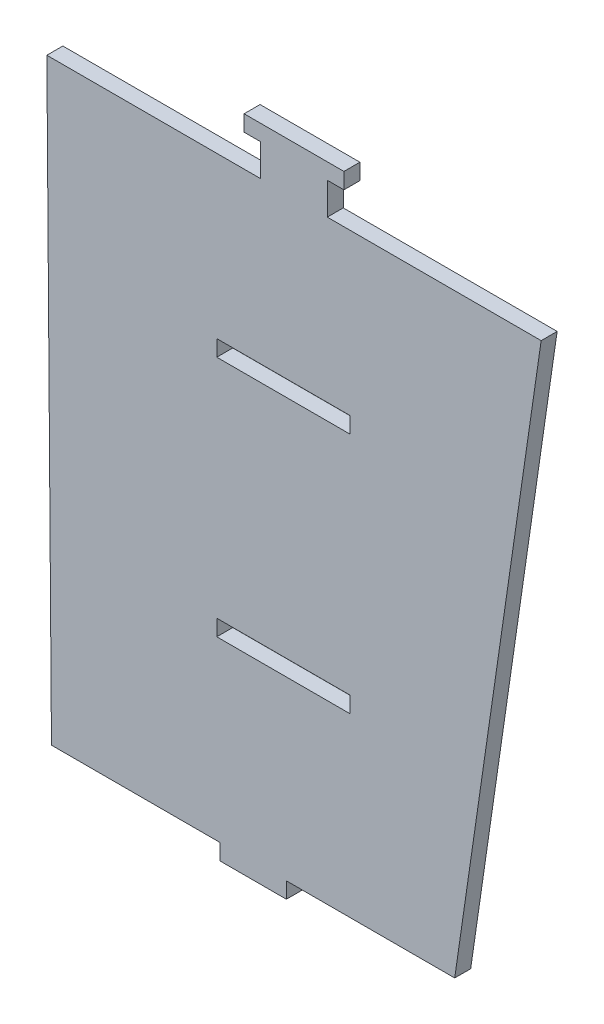
ISO-10303-21;
HEADER;
FILE_DESCRIPTION(('STEP AP214'),'2;1');
FILE_NAME('part.step','',(''),(''),'','','');
FILE_SCHEMA(('AUTOMOTIVE_DESIGN { 1 0 10303 214 1 1 1 1 }'));
ENDSEC;
DATA;
#1=APPLICATION_CONTEXT('core data for automotive mechanical design processes');
#2=APPLICATION_PROTOCOL_DEFINITION('international standard','automotive_design',2000,#1);
#3=PRODUCT_CONTEXT('',#1,'mechanical');
#4=PRODUCT('Part','Part','',(#3));
#5=PRODUCT_RELATED_PRODUCT_CATEGORY('part','',(#4));
#6=PRODUCT_DEFINITION_FORMATION('','',#4);
#7=PRODUCT_DEFINITION_CONTEXT('part definition',#1,'design');
#8=PRODUCT_DEFINITION('design','',#6,#7);
#9=PRODUCT_DEFINITION_SHAPE('','',#8);
#10=(LENGTH_UNIT() NAMED_UNIT(*) SI_UNIT(.MILLI.,.METRE.));
#11=(NAMED_UNIT(*) PLANE_ANGLE_UNIT() SI_UNIT($,.RADIAN.));
#12=(NAMED_UNIT(*) SI_UNIT($,.STERADIAN.) SOLID_ANGLE_UNIT());
#13=UNCERTAINTY_MEASURE_WITH_UNIT(LENGTH_MEASURE(1.E-05),#10,'distance_accuracy_value','');
#14=(GEOMETRIC_REPRESENTATION_CONTEXT(3) GLOBAL_UNCERTAINTY_ASSIGNED_CONTEXT((#13)) GLOBAL_UNIT_ASSIGNED_CONTEXT((#10,
#11,#12)) REPRESENTATION_CONTEXT('',''));
#15=CARTESIAN_POINT('',(0.,0.,0.));
#16=DIRECTION('',(0.,0.,1.));
#17=DIRECTION('',(1.,0.,0.));
#18=AXIS2_PLACEMENT_3D('',#15,#16,#17);
#19=CARTESIAN_POINT('',(-122.883521437337,-1.524,1.524));
#20=DIRECTION('',(0.,-1.,0.));
#21=DIRECTION('',(0.,0.,-1.));
#22=AXIS2_PLACEMENT_3D('',#19,#20,#21);
#23=PLANE('',#22);
#24=DIRECTION('',(-1.,0.,0.));
#25=VECTOR('',#24,1.);
#26=CARTESIAN_POINT('',(-122.883521437337,-1.524,0.));
#27=LINE('',#26,#25);
#28=CARTESIAN_POINT('',(-102.477755774951,-1.524,0.));
#29=VERTEX_POINT('',#28);
#30=CARTESIAN_POINT('',(-122.883521437337,-1.524,0.));
#31=VERTEX_POINT('',#30);
#32=EDGE_CURVE('E260',#29,#31,#27,.T.);
#33=ORIENTED_EDGE('',*,*,#32,.T.);
#34=DIRECTION('',(0.,0.,-1.));
#35=VECTOR('',#34,1.);
#36=CARTESIAN_POINT('',(-122.883521437337,-1.524,1.524));
#37=LINE('',#36,#35);
#38=CARTESIAN_POINT('',(-122.883521437337,-1.524,1.524));
#39=VERTEX_POINT('',#38);
#40=EDGE_CURVE('E11',#39,#31,#37,.T.);
#41=ORIENTED_EDGE('',*,*,#40,.F.);
#42=DIRECTION('',(-1.,0.,0.));
#43=VECTOR('',#42,1.);
#44=CARTESIAN_POINT('',(-122.883521437337,-1.524,1.524));
#45=LINE('',#44,#43);
#46=CARTESIAN_POINT('',(-102.477755774951,-1.524,1.524));
#47=VERTEX_POINT('',#46);
#48=EDGE_CURVE('E267',#47,#39,#45,.T.);
#49=ORIENTED_EDGE('',*,*,#48,.F.);
#50=DIRECTION('',(0.,0.,-1.));
#51=VECTOR('',#50,1.);
#52=CARTESIAN_POINT('',(-102.477755774951,-1.524,1.524));
#53=LINE('',#52,#51);
#54=EDGE_CURVE('E301',#47,#29,#53,.T.);
#55=ORIENTED_EDGE('',*,*,#54,.T.);
#56=EDGE_LOOP('',(#33,#41,#49,#55));
#57=FACE_BOUND('',#56,.T.);
#58=ADVANCED_FACE('F38',(#57),#23,.F.);
#59=CARTESIAN_POINT('',(-122.883521437337,-1.524,1.524));
#60=DIRECTION('',(-1.,0.,0.));
#61=DIRECTION('',(0.,0.,1.));
#62=AXIS2_PLACEMENT_3D('',#59,#60,#61);
#63=PLANE('',#62);
#64=DIRECTION('',(0.,1.,0.));
#65=VECTOR('',#64,1.);
#66=CARTESIAN_POINT('',(-122.883521437337,-1.524,0.));
#67=LINE('',#66,#65);
#68=CARTESIAN_POINT('',(-122.883521437337,1.524,0.));
#69=VERTEX_POINT('',#68);
#70=EDGE_CURVE('E304',#31,#69,#67,.T.);
#71=ORIENTED_EDGE('',*,*,#70,.T.);
#72=DIRECTION('',(0.,0.,-1.));
#73=VECTOR('',#72,1.);
#74=CARTESIAN_POINT('',(-122.883521437337,1.524,1.524));
#75=LINE('',#74,#73);
#76=CARTESIAN_POINT('',(-122.883521437337,1.524,1.524));
#77=VERTEX_POINT('',#76);
#78=EDGE_CURVE('E45',#77,#69,#75,.T.);
#79=ORIENTED_EDGE('',*,*,#78,.F.);
#80=DIRECTION('',(0.,1.,0.));
#81=VECTOR('',#80,1.);
#82=CARTESIAN_POINT('',(-122.883521437337,-1.524,1.524));
#83=LINE('',#82,#81);
#84=EDGE_CURVE('E270',#39,#77,#83,.T.);
#85=ORIENTED_EDGE('',*,*,#84,.F.);
#86=ORIENTED_EDGE('',*,*,#40,.T.);
#87=EDGE_LOOP('',(#71,#79,#85,#86));
#88=FACE_BOUND('',#87,.T.);
#89=ADVANCED_FACE('F400',(#88),#63,.F.);
#90=CARTESIAN_POINT('',(-121.296021437337,1.524,1.524));
#91=DIRECTION('',(0.,1.,0.));
#92=DIRECTION('',(0.,0.,1.));
#93=AXIS2_PLACEMENT_3D('',#90,#91,#92);
#94=PLANE('',#93);
#95=DIRECTION('',(1.,0.,0.));
#96=VECTOR('',#95,1.);
#97=CARTESIAN_POINT('',(-121.296021437337,1.524,0.));
#98=LINE('',#97,#96);
#99=CARTESIAN_POINT('',(-121.296021437337,1.524,0.));
#100=VERTEX_POINT('',#99);
#101=EDGE_CURVE('E306',#69,#100,#98,.T.);
#102=ORIENTED_EDGE('',*,*,#101,.T.);
#103=DIRECTION('',(0.,0.,-1.));
#104=VECTOR('',#103,1.);
#105=CARTESIAN_POINT('',(-121.296021437337,1.524,1.524));
#106=LINE('',#105,#104);
#107=CARTESIAN_POINT('',(-121.296021437337,1.524,1.524));
#108=VERTEX_POINT('',#107);
#109=EDGE_CURVE('E371',#108,#100,#106,.T.);
#110=ORIENTED_EDGE('',*,*,#109,.F.);
#111=DIRECTION('',(1.,0.,0.));
#112=VECTOR('',#111,1.);
#113=CARTESIAN_POINT('',(-121.296021437337,1.524,1.524));
#114=LINE('',#113,#112);
#115=EDGE_CURVE('E273',#77,#108,#114,.T.);
#116=ORIENTED_EDGE('',*,*,#115,.F.);
#117=ORIENTED_EDGE('',*,*,#78,.T.);
#118=EDGE_LOOP('',(#102,#110,#116,#117));
#119=FACE_BOUND('',#118,.T.);
#120=ADVANCED_FACE('F378',(#119),#94,.F.);
#121=CARTESIAN_POINT('',(-121.296021437337,1.524,1.524));
#122=DIRECTION('',(-1.,0.,0.));
#123=DIRECTION('',(0.,0.,1.));
#124=AXIS2_PLACEMENT_3D('',#121,#122,#123);
#125=PLANE('',#124);
#126=DIRECTION('',(0.,1.,0.));
#127=VECTOR('',#126,1.);
#128=CARTESIAN_POINT('',(-121.296021437337,1.524,0.));
#129=LINE('',#128,#127);
#130=CARTESIAN_POINT('',(-121.296021437337,3.048,0.));
#131=VERTEX_POINT('',#130);
#132=EDGE_CURVE('E308',#100,#131,#129,.T.);
#133=ORIENTED_EDGE('',*,*,#132,.T.);
#134=DIRECTION('',(0.,0.,-1.));
#135=VECTOR('',#134,1.);
#136=CARTESIAN_POINT('',(-121.296021437337,3.048,1.524));
#137=LINE('',#136,#135);
#138=CARTESIAN_POINT('',(-121.296021437337,3.048,1.524));
#139=VERTEX_POINT('',#138);
#140=EDGE_CURVE('E368',#139,#131,#137,.T.);
#141=ORIENTED_EDGE('',*,*,#140,.F.);
#142=DIRECTION('',(0.,1.,0.));
#143=VECTOR('',#142,1.);
#144=CARTESIAN_POINT('',(-121.296021437337,1.524,1.524));
#145=LINE('',#144,#143);
#146=EDGE_CURVE('E275',#108,#139,#145,.T.);
#147=ORIENTED_EDGE('',*,*,#146,.F.);
#148=ORIENTED_EDGE('',*,*,#109,.T.);
#149=EDGE_LOOP('',(#133,#141,#147,#148));
#150=FACE_BOUND('',#149,.T.);
#151=ADVANCED_FACE('F388',(#150),#125,.F.);
#152=CARTESIAN_POINT('',(-121.296021437337,3.048,1.524));
#153=DIRECTION('',(0.,-1.,0.));
#154=DIRECTION('',(0.,0.,-1.));
#155=AXIS2_PLACEMENT_3D('',#152,#153,#154);
#156=PLANE('',#155);
#157=DIRECTION('',(-1.,0.,0.));
#158=VECTOR('',#157,1.);
#159=CARTESIAN_POINT('',(-121.296021437337,3.048,0.));
#160=LINE('',#159,#158);
#161=CARTESIAN_POINT('',(-130.821021437337,3.048,0.));
#162=VERTEX_POINT('',#161);
#163=EDGE_CURVE('E310',#131,#162,#160,.T.);
#164=ORIENTED_EDGE('',*,*,#163,.T.);
#165=DIRECTION('',(0.,0.,-1.));
#166=VECTOR('',#165,1.);
#167=CARTESIAN_POINT('',(-130.821021437337,3.048,1.524));
#168=LINE('',#167,#166);
#169=CARTESIAN_POINT('',(-130.821021437337,3.048,1.524));
#170=VERTEX_POINT('',#169);
#171=EDGE_CURVE('E365',#170,#162,#168,.T.);
#172=ORIENTED_EDGE('',*,*,#171,.F.);
#173=DIRECTION('',(-1.,0.,0.));
#174=VECTOR('',#173,1.);
#175=CARTESIAN_POINT('',(-121.296021437337,3.048,1.524));
#176=LINE('',#175,#174);
#177=EDGE_CURVE('E277',#139,#170,#176,.T.);
#178=ORIENTED_EDGE('',*,*,#177,.F.);
#179=ORIENTED_EDGE('',*,*,#140,.T.);
#180=EDGE_LOOP('',(#164,#172,#178,#179));
#181=FACE_BOUND('',#180,.T.);
#182=ADVANCED_FACE('F392',(#181),#156,.F.);
#183=CARTESIAN_POINT('',(-130.821021437337,1.524,1.524));
#184=DIRECTION('',(1.,0.,0.));
#185=DIRECTION('',(0.,0.,-1.));
#186=AXIS2_PLACEMENT_3D('',#183,#184,#185);
#187=PLANE('',#186);
#188=DIRECTION('',(0.,-1.,0.));
#189=VECTOR('',#188,1.);
#190=CARTESIAN_POINT('',(-130.821021437337,1.524,0.));
#191=LINE('',#190,#189);
#192=CARTESIAN_POINT('',(-130.821021437337,1.524,0.));
#193=VERTEX_POINT('',#192);
#194=EDGE_CURVE('E312',#162,#193,#191,.T.);
#195=ORIENTED_EDGE('',*,*,#194,.T.);
#196=DIRECTION('',(0.,0.,-1.));
#197=VECTOR('',#196,1.);
#198=CARTESIAN_POINT('',(-130.821021437337,1.524,1.524));
#199=LINE('',#198,#197);
#200=CARTESIAN_POINT('',(-130.821021437337,1.524,1.524));
#201=VERTEX_POINT('',#200);
#202=EDGE_CURVE('E362',#201,#193,#199,.T.);
#203=ORIENTED_EDGE('',*,*,#202,.F.);
#204=DIRECTION('',(0.,-1.,0.));
#205=VECTOR('',#204,1.);
#206=CARTESIAN_POINT('',(-130.821021437337,1.524,1.524));
#207=LINE('',#206,#205);
#208=EDGE_CURVE('E279',#170,#201,#207,.T.);
#209=ORIENTED_EDGE('',*,*,#208,.F.);
#210=ORIENTED_EDGE('',*,*,#171,.T.);
#211=EDGE_LOOP('',(#195,#203,#209,#210));
#212=FACE_BOUND('',#211,.T.);
#213=ADVANCED_FACE('F453',(#212),#187,.F.);
#214=CARTESIAN_POINT('',(-129.233521437337,1.524,1.524));
#215=DIRECTION('',(0.,1.,0.));
#216=DIRECTION('',(0.,0.,1.));
#217=AXIS2_PLACEMENT_3D('',#214,#215,#216);
#218=PLANE('',#217);
#219=DIRECTION('',(1.,0.,0.));
#220=VECTOR('',#219,1.);
#221=CARTESIAN_POINT('',(-129.233521437337,1.524,0.));
#222=LINE('',#221,#220);
#223=CARTESIAN_POINT('',(-129.233521437337,1.524,0.));
#224=VERTEX_POINT('',#223);
#225=EDGE_CURVE('E314',#193,#224,#222,.T.);
#226=ORIENTED_EDGE('',*,*,#225,.T.);
#227=DIRECTION('',(0.,0.,-1.));
#228=VECTOR('',#227,1.);
#229=CARTESIAN_POINT('',(-129.233521437337,1.524,1.524));
#230=LINE('',#229,#228);
#231=CARTESIAN_POINT('',(-129.233521437337,1.524,1.524));
#232=VERTEX_POINT('',#231);
#233=EDGE_CURVE('E359',#232,#224,#230,.T.);
#234=ORIENTED_EDGE('',*,*,#233,.F.);
#235=DIRECTION('',(1.,0.,0.));
#236=VECTOR('',#235,1.);
#237=CARTESIAN_POINT('',(-129.233521437337,1.524,1.524));
#238=LINE('',#237,#236);
#239=EDGE_CURVE('E281',#201,#232,#238,.T.);
#240=ORIENTED_EDGE('',*,*,#239,.F.);
#241=ORIENTED_EDGE('',*,*,#202,.T.);
#242=EDGE_LOOP('',(#226,#234,#240,#241));
#243=FACE_BOUND('',#242,.T.);
#244=ADVANCED_FACE('F450',(#243),#218,.F.);
#245=CARTESIAN_POINT('',(-129.233521437337,-1.524,1.524));
#246=DIRECTION('',(1.,0.,0.));
#247=DIRECTION('',(0.,0.,-1.));
#248=AXIS2_PLACEMENT_3D('',#245,#246,#247);
#249=PLANE('',#248);
#250=DIRECTION('',(0.,-1.,0.));
#251=VECTOR('',#250,1.);
#252=CARTESIAN_POINT('',(-129.233521437337,-1.524,0.));
#253=LINE('',#252,#251);
#254=CARTESIAN_POINT('',(-129.233521437337,-1.524,0.));
#255=VERTEX_POINT('',#254);
#256=EDGE_CURVE('E316',#224,#255,#253,.T.);
#257=ORIENTED_EDGE('',*,*,#256,.T.);
#258=DIRECTION('',(0.,0.,-1.));
#259=VECTOR('',#258,1.);
#260=CARTESIAN_POINT('',(-129.233521437337,-1.524,1.524));
#261=LINE('',#260,#259);
#262=CARTESIAN_POINT('',(-129.233521437337,-1.524,1.524));
#263=VERTEX_POINT('',#262);
#264=EDGE_CURVE('E356',#263,#255,#261,.T.);
#265=ORIENTED_EDGE('',*,*,#264,.F.);
#266=DIRECTION('',(0.,-1.,0.));
#267=VECTOR('',#266,1.);
#268=CARTESIAN_POINT('',(-129.233521437337,-1.524,1.524));
#269=LINE('',#268,#267);
#270=EDGE_CURVE('E283',#232,#263,#269,.T.);
#271=ORIENTED_EDGE('',*,*,#270,.F.);
#272=ORIENTED_EDGE('',*,*,#233,.T.);
#273=EDGE_LOOP('',(#257,#265,#271,#272));
#274=FACE_BOUND('',#273,.T.);
#275=ADVANCED_FACE('F446',(#274),#249,.F.);
#276=CARTESIAN_POINT('',(-149.639287099722,-1.524,1.524));
#277=DIRECTION('',(0.,-1.,0.));
#278=DIRECTION('',(0.,0.,-1.));
#279=AXIS2_PLACEMENT_3D('',#276,#277,#278);
#280=PLANE('',#279);
#281=DIRECTION('',(-1.,0.,0.));
#282=VECTOR('',#281,1.);
#283=CARTESIAN_POINT('',(-149.639287099722,-1.524,0.));
#284=LINE('',#283,#282);
#285=CARTESIAN_POINT('',(-149.639287099722,-1.524,0.));
#286=VERTEX_POINT('',#285);
#287=EDGE_CURVE('E318',#255,#286,#284,.T.);
#288=ORIENTED_EDGE('',*,*,#287,.T.);
#289=DIRECTION('',(0.,0.,-1.));
#290=VECTOR('',#289,1.);
#291=CARTESIAN_POINT('',(-149.639287099722,-1.524,1.524));
#292=LINE('',#291,#290);
#293=CARTESIAN_POINT('',(-149.639287099722,-1.524,1.524));
#294=VERTEX_POINT('',#293);
#295=EDGE_CURVE('E353',#294,#286,#292,.T.);
#296=ORIENTED_EDGE('',*,*,#295,.F.);
#297=DIRECTION('',(-1.,0.,0.));
#298=VECTOR('',#297,1.);
#299=CARTESIAN_POINT('',(-149.639287099722,-1.524,1.524));
#300=LINE('',#299,#298);
#301=EDGE_CURVE('E285',#263,#294,#300,.T.);
#302=ORIENTED_EDGE('',*,*,#301,.F.);
#303=ORIENTED_EDGE('',*,*,#264,.T.);
#304=EDGE_LOOP('',(#288,#296,#302,#303));
#305=FACE_BOUND('',#304,.T.);
#306=ADVANCED_FACE('F442',(#305),#280,.F.);
#307=CARTESIAN_POINT('',(-149.199401915009,-58.314338925609,1.524));
#308=DIRECTION('',(0.999970002835002,0.00774554259978691,0.));
#309=DIRECTION('',(-0.00774554259978691,0.999970002835003,0.));
#310=AXIS2_PLACEMENT_3D('',#307,#308,#309);
#311=PLANE('',#310);
#312=DIRECTION('',(0.00774554259978691,-0.999970002835002,0.));
#313=VECTOR('',#312,1.);
#314=CARTESIAN_POINT('',(-149.199401915009,-58.314338925609,0.));
#315=LINE('',#314,#313);
#316=CARTESIAN_POINT('',(-149.199401915009,-58.314338925609,0.));
#317=VERTEX_POINT('',#316);
#318=EDGE_CURVE('E320',#286,#317,#315,.T.);
#319=ORIENTED_EDGE('',*,*,#318,.T.);
#320=DIRECTION('',(0.,0.,-1.));
#321=VECTOR('',#320,1.);
#322=CARTESIAN_POINT('',(-149.199401915009,-58.314338925609,1.524));
#323=LINE('',#322,#321);
#324=CARTESIAN_POINT('',(-149.199401915009,-58.314338925609,1.524));
#325=VERTEX_POINT('',#324);
#326=EDGE_CURVE('E350',#325,#317,#323,.T.);
#327=ORIENTED_EDGE('',*,*,#326,.F.);
#328=DIRECTION('',(0.00774554259978691,-0.999970002835002,0.));
#329=VECTOR('',#328,1.);
#330=CARTESIAN_POINT('',(-149.199401915009,-58.314338925609,1.524));
#331=LINE('',#330,#329);
#332=EDGE_CURVE('E287',#294,#325,#331,.T.);
#333=ORIENTED_EDGE('',*,*,#332,.F.);
#334=ORIENTED_EDGE('',*,*,#295,.T.);
#335=EDGE_LOOP('',(#319,#327,#333,#334));
#336=FACE_BOUND('',#335,.T.);
#337=ADVANCED_FACE('F437',(#336),#311,.F.);
#338=CARTESIAN_POINT('',(-133.13789889878,-58.314338925609,1.524));
#339=DIRECTION('',(0.,1.,0.));
#340=DIRECTION('',(-1.,0.,0.));
#341=AXIS2_PLACEMENT_3D('',#338,#339,#340);
#342=PLANE('',#341);
#343=DIRECTION('',(1.,0.,0.));
#344=VECTOR('',#343,1.);
#345=CARTESIAN_POINT('',(-133.13789889878,-58.314338925609,0.));
#346=LINE('',#345,#344);
#347=CARTESIAN_POINT('',(-133.13789889878,-58.314338925609,0.));
#348=VERTEX_POINT('',#347);
#349=EDGE_CURVE('E322',#317,#348,#346,.T.);
#350=ORIENTED_EDGE('',*,*,#349,.T.);
#351=DIRECTION('',(0.,0.,-1.));
#352=VECTOR('',#351,1.);
#353=CARTESIAN_POINT('',(-133.13789889878,-58.314338925609,1.524));
#354=LINE('',#353,#352);
#355=CARTESIAN_POINT('',(-133.13789889878,-58.314338925609,1.524));
#356=VERTEX_POINT('',#355);
#357=EDGE_CURVE('E347',#356,#348,#354,.T.);
#358=ORIENTED_EDGE('',*,*,#357,.F.);
#359=DIRECTION('',(1.,0.,0.));
#360=VECTOR('',#359,1.);
#361=CARTESIAN_POINT('',(-133.13789889878,-58.314338925609,1.524));
#362=LINE('',#361,#360);
#363=EDGE_CURVE('E289',#325,#356,#362,.T.);
#364=ORIENTED_EDGE('',*,*,#363,.F.);
#365=ORIENTED_EDGE('',*,*,#326,.T.);
#366=EDGE_LOOP('',(#350,#358,#364,#365));
#367=FACE_BOUND('',#366,.T.);
#368=ADVANCED_FACE('F431',(#367),#342,.F.);
#369=CARTESIAN_POINT('',(-133.13789889878,-58.314338925609,1.524));
#370=DIRECTION('',(1.,0.,0.));
#371=DIRECTION('',(0.,0.,-1.));
#372=AXIS2_PLACEMENT_3D('',#369,#370,#371);
#373=PLANE('',#372);
#374=DIRECTION('',(0.,-1.,0.));
#375=VECTOR('',#374,1.);
#376=CARTESIAN_POINT('',(-133.13789889878,-58.314338925609,0.));
#377=LINE('',#376,#375);
#378=CARTESIAN_POINT('',(-133.13789889878,-59.838338925609,0.));
#379=VERTEX_POINT('',#378);
#380=EDGE_CURVE('E324',#348,#379,#377,.T.);
#381=ORIENTED_EDGE('',*,*,#380,.T.);
#382=DIRECTION('',(0.,0.,-1.));
#383=VECTOR('',#382,1.);
#384=CARTESIAN_POINT('',(-133.13789889878,-59.838338925609,1.524));
#385=LINE('',#384,#383);
#386=CARTESIAN_POINT('',(-133.13789889878,-59.838338925609,1.524));
#387=VERTEX_POINT('',#386);
#388=EDGE_CURVE('E344',#387,#379,#385,.T.);
#389=ORIENTED_EDGE('',*,*,#388,.F.);
#390=DIRECTION('',(0.,-1.,0.));
#391=VECTOR('',#390,1.);
#392=CARTESIAN_POINT('',(-133.13789889878,-58.314338925609,1.524));
#393=LINE('',#392,#391);
#394=EDGE_CURVE('E291',#356,#387,#393,.T.);
#395=ORIENTED_EDGE('',*,*,#394,.F.);
#396=ORIENTED_EDGE('',*,*,#357,.T.);
#397=EDGE_LOOP('',(#381,#389,#395,#396));
#398=FACE_BOUND('',#397,.T.);
#399=ADVANCED_FACE('F427',(#398),#373,.F.);
#400=CARTESIAN_POINT('',(-133.13789889878,-59.838338925609,1.524));
#401=DIRECTION('',(0.,1.,0.));
#402=DIRECTION('',(0.,0.,1.));
#403=AXIS2_PLACEMENT_3D('',#400,#401,#402);
#404=PLANE('',#403);
#405=DIRECTION('',(1.,0.,0.));
#406=VECTOR('',#405,1.);
#407=CARTESIAN_POINT('',(-133.13789889878,-59.838338925609,0.));
#408=LINE('',#407,#406);
#409=CARTESIAN_POINT('',(-126.78789889878,-59.838338925609,0.));
#410=VERTEX_POINT('',#409);
#411=EDGE_CURVE('E326',#379,#410,#408,.T.);
#412=ORIENTED_EDGE('',*,*,#411,.T.);
#413=DIRECTION('',(0.,0.,-1.));
#414=VECTOR('',#413,1.);
#415=CARTESIAN_POINT('',(-126.78789889878,-59.838338925609,1.524));
#416=LINE('',#415,#414);
#417=CARTESIAN_POINT('',(-126.78789889878,-59.838338925609,1.524));
#418=VERTEX_POINT('',#417);
#419=EDGE_CURVE('E341',#418,#410,#416,.T.);
#420=ORIENTED_EDGE('',*,*,#419,.F.);
#421=DIRECTION('',(1.,0.,0.));
#422=VECTOR('',#421,1.);
#423=CARTESIAN_POINT('',(-133.13789889878,-59.838338925609,1.524));
#424=LINE('',#423,#422);
#425=EDGE_CURVE('E293',#387,#418,#424,.T.);
#426=ORIENTED_EDGE('',*,*,#425,.F.);
#427=ORIENTED_EDGE('',*,*,#388,.T.);
#428=EDGE_LOOP('',(#412,#420,#426,#427));
#429=FACE_BOUND('',#428,.T.);
#430=ADVANCED_FACE('F422',(#429),#404,.F.);
#431=CARTESIAN_POINT('',(-126.78789889878,-58.314338925609,1.524));
#432=DIRECTION('',(-1.,0.,0.));
#433=DIRECTION('',(0.,0.,1.));
#434=AXIS2_PLACEMENT_3D('',#431,#432,#433);
#435=PLANE('',#434);
#436=DIRECTION('',(0.,1.,0.));
#437=VECTOR('',#436,1.);
#438=CARTESIAN_POINT('',(-126.78789889878,-58.314338925609,0.));
#439=LINE('',#438,#437);
#440=CARTESIAN_POINT('',(-126.78789889878,-58.314338925609,0.));
#441=VERTEX_POINT('',#440);
#442=EDGE_CURVE('E328',#410,#441,#439,.T.);
#443=ORIENTED_EDGE('',*,*,#442,.T.);
#444=DIRECTION('',(0.,0.,-1.));
#445=VECTOR('',#444,1.);
#446=CARTESIAN_POINT('',(-126.78789889878,-58.314338925609,1.524));
#447=LINE('',#446,#445);
#448=CARTESIAN_POINT('',(-126.78789889878,-58.314338925609,1.524));
#449=VERTEX_POINT('',#448);
#450=EDGE_CURVE('E338',#449,#441,#447,.T.);
#451=ORIENTED_EDGE('',*,*,#450,.F.);
#452=DIRECTION('',(0.,1.,0.));
#453=VECTOR('',#452,1.);
#454=CARTESIAN_POINT('',(-126.78789889878,-58.314338925609,1.524));
#455=LINE('',#454,#453);
#456=EDGE_CURVE('E295',#418,#449,#455,.T.);
#457=ORIENTED_EDGE('',*,*,#456,.F.);
#458=ORIENTED_EDGE('',*,*,#419,.T.);
#459=EDGE_LOOP('',(#443,#451,#457,#458));
#460=FACE_BOUND('',#459,.T.);
#461=ADVANCED_FACE('F416',(#460),#435,.F.);
#462=CARTESIAN_POINT('',(-110.726395882551,-58.314338925609,1.524));
#463=DIRECTION('',(0.,1.,0.));
#464=DIRECTION('',(0.,0.,1.));
#465=AXIS2_PLACEMENT_3D('',#462,#463,#464);
#466=PLANE('',#465);
#467=DIRECTION('',(1.,0.,0.));
#468=VECTOR('',#467,1.);
#469=CARTESIAN_POINT('',(-110.726395882551,-58.314338925609,0.));
#470=LINE('',#469,#468);
#471=CARTESIAN_POINT('',(-110.726395882551,-58.314338925609,0.));
#472=VERTEX_POINT('',#471);
#473=EDGE_CURVE('E330',#441,#472,#470,.T.);
#474=ORIENTED_EDGE('',*,*,#473,.T.);
#475=DIRECTION('',(0.,0.,-1.));
#476=VECTOR('',#475,1.);
#477=CARTESIAN_POINT('',(-110.726395882551,-58.314338925609,1.524));
#478=LINE('',#477,#476);
#479=CARTESIAN_POINT('',(-110.726395882551,-58.314338925609,1.524));
#480=VERTEX_POINT('',#479);
#481=EDGE_CURVE('E335',#480,#472,#478,.T.);
#482=ORIENTED_EDGE('',*,*,#481,.F.);
#483=DIRECTION('',(1.,0.,0.));
#484=VECTOR('',#483,1.);
#485=CARTESIAN_POINT('',(-110.726395882551,-58.314338925609,1.524));
#486=LINE('',#485,#484);
#487=EDGE_CURVE('E297',#449,#480,#486,.T.);
#488=ORIENTED_EDGE('',*,*,#487,.F.);
#489=ORIENTED_EDGE('',*,*,#450,.T.);
#490=EDGE_LOOP('',(#474,#482,#488,#489));
#491=FACE_BOUND('',#490,.T.);
#492=ADVANCED_FACE('F412',(#491),#466,.F.);
#493=CARTESIAN_POINT('',(-102.477755774951,-1.524,1.524));
#494=DIRECTION('',(-0.98961564073596,0.143738942568655,0.));
#495=DIRECTION('',(-0.143738942568655,-0.98961564073596,0.));
#496=AXIS2_PLACEMENT_3D('',#493,#494,#495);
#497=PLANE('',#496);
#498=DIRECTION('',(0.143738942568655,0.98961564073596,0.));
#499=VECTOR('',#498,1.);
#500=CARTESIAN_POINT('',(-102.477755774951,-1.524,0.));
#501=LINE('',#500,#499);
#502=EDGE_CURVE('E271',#472,#29,#501,.T.);
#503=ORIENTED_EDGE('',*,*,#502,.T.);
#504=ORIENTED_EDGE('',*,*,#54,.F.);
#505=DIRECTION('',(0.143738942568655,0.98961564073596,0.));
#506=VECTOR('',#505,1.);
#507=CARTESIAN_POINT('',(-102.477755774951,-1.524,1.524));
#508=LINE('',#507,#506);
#509=EDGE_CURVE('E299',#480,#47,#508,.T.);
#510=ORIENTED_EDGE('',*,*,#509,.F.);
#511=ORIENTED_EDGE('',*,*,#481,.T.);
#512=EDGE_LOOP('',(#503,#504,#510,#511));
#513=FACE_BOUND('',#512,.T.);
#514=ADVANCED_FACE('F407',(#513),#497,.F.);
#515=CARTESIAN_POINT('',(0.,0.,1.524));
#516=DIRECTION('',(0.,0.,-1.));
#517=DIRECTION('',(-1.,0.,0.));
#518=AXIS2_PLACEMENT_3D('',#515,#516,#517);
#519=PLANE('',#518);
#520=DIRECTION('',(0.,1.,0.));
#521=VECTOR('',#520,1.);
#522=CARTESIAN_POINT('',(-120.728752717354,-41.4719125896507,1.524));
#523=LINE('',#522,#521);
#524=CARTESIAN_POINT('',(-120.728752717354,-41.4719125896507,1.524));
#525=VERTEX_POINT('',#524);
#526=CARTESIAN_POINT('',(-120.728752717354,-39.9341821648906,1.524));
#527=VERTEX_POINT('',#526);
#528=EDGE_CURVE('E225',#525,#527,#523,.T.);
#529=ORIENTED_EDGE('',*,*,#528,.F.);
#530=DIRECTION('',(1.,0.,0.));
#531=VECTOR('',#530,1.);
#532=CARTESIAN_POINT('',(-120.728752717354,-41.4719125896507,1.524));
#533=LINE('',#532,#531);
#534=CARTESIAN_POINT('',(-133.428752717354,-41.4719125896507,1.524));
#535=VERTEX_POINT('',#534);
#536=EDGE_CURVE('E52',#535,#525,#533,.T.);
#537=ORIENTED_EDGE('',*,*,#536,.F.);
#538=DIRECTION('',(0.,-1.,0.));
#539=VECTOR('',#538,1.);
#540=CARTESIAN_POINT('',(-133.428752717354,-41.4719125896507,1.524));
#541=LINE('',#540,#539);
#542=CARTESIAN_POINT('',(-133.428752717354,-39.9341821648906,1.524));
#543=VERTEX_POINT('',#542);
#544=EDGE_CURVE('E216',#543,#535,#541,.T.);
#545=ORIENTED_EDGE('',*,*,#544,.F.);
#546=DIRECTION('',(-1.,0.,0.));
#547=VECTOR('',#546,1.);
#548=CARTESIAN_POINT('',(-120.728752717354,-39.9341821648906,1.524));
#549=LINE('',#548,#547);
#550=EDGE_CURVE('E219',#527,#543,#549,.T.);
#551=ORIENTED_EDGE('',*,*,#550,.F.);
#552=EDGE_LOOP('',(#529,#537,#545,#551));
#553=FACE_BOUND('',#552,.T.);
#554=DIRECTION('',(0.,1.,0.));
#555=VECTOR('',#554,1.);
#556=CARTESIAN_POINT('',(-120.728752717354,-18.370876524361,1.524));
#557=LINE('',#556,#555);
#558=CARTESIAN_POINT('',(-120.728752717354,-18.370876524361,1.524));
#559=VERTEX_POINT('',#558);
#560=CARTESIAN_POINT('',(-120.728752717354,-16.8331460996009,1.524));
#561=VERTEX_POINT('',#560);
#562=EDGE_CURVE('E250',#559,#561,#557,.T.);
#563=ORIENTED_EDGE('',*,*,#562,.F.);
#564=DIRECTION('',(1.,0.,0.));
#565=VECTOR('',#564,1.);
#566=CARTESIAN_POINT('',(-120.728752717354,-18.370876524361,1.524));
#567=LINE('',#566,#565);
#568=CARTESIAN_POINT('',(-133.428752717354,-18.370876524361,1.524));
#569=VERTEX_POINT('',#568);
#570=EDGE_CURVE('E231',#569,#559,#567,.T.);
#571=ORIENTED_EDGE('',*,*,#570,.F.);
#572=DIRECTION('',(0.,-1.,0.));
#573=VECTOR('',#572,1.);
#574=CARTESIAN_POINT('',(-133.428752717354,-18.370876524361,1.524));
#575=LINE('',#574,#573);
#576=CARTESIAN_POINT('',(-133.428752717354,-16.8331460996009,1.524));
#577=VERTEX_POINT('',#576);
#578=EDGE_CURVE('E239',#577,#569,#575,.T.);
#579=ORIENTED_EDGE('',*,*,#578,.F.);
#580=DIRECTION('',(-1.,0.,0.));
#581=VECTOR('',#580,1.);
#582=CARTESIAN_POINT('',(-120.728752717354,-16.8331460996009,1.524));
#583=LINE('',#582,#581);
#584=EDGE_CURVE('E253',#561,#577,#583,.T.);
#585=ORIENTED_EDGE('',*,*,#584,.F.);
#586=EDGE_LOOP('',(#563,#571,#579,#585));
#587=FACE_BOUND('',#586,.T.);
#588=ORIENTED_EDGE('',*,*,#48,.T.);
#589=ORIENTED_EDGE('',*,*,#84,.T.);
#590=ORIENTED_EDGE('',*,*,#115,.T.);
#591=ORIENTED_EDGE('',*,*,#146,.T.);
#592=ORIENTED_EDGE('',*,*,#177,.T.);
#593=ORIENTED_EDGE('',*,*,#208,.T.);
#594=ORIENTED_EDGE('',*,*,#239,.T.);
#595=ORIENTED_EDGE('',*,*,#270,.T.);
#596=ORIENTED_EDGE('',*,*,#301,.T.);
#597=ORIENTED_EDGE('',*,*,#332,.T.);
#598=ORIENTED_EDGE('',*,*,#363,.T.);
#599=ORIENTED_EDGE('',*,*,#394,.T.);
#600=ORIENTED_EDGE('',*,*,#425,.T.);
#601=ORIENTED_EDGE('',*,*,#456,.T.);
#602=ORIENTED_EDGE('',*,*,#487,.T.);
#603=ORIENTED_EDGE('',*,*,#509,.T.);
#604=EDGE_LOOP('',(#588,#589,#590,#591,#592,#593,#594,#595,#596,#597,#598,#599,#600,#601,#602,#603));
#605=FACE_BOUND('',#604,.T.);
#606=ADVANCED_FACE('F396',(#553,#587,#605),#519,.F.);
#607=CARTESIAN_POINT('',(0.,0.,0.));
#608=DIRECTION('',(0.,0.,-1.));
#609=DIRECTION('',(-1.,0.,0.));
#610=AXIS2_PLACEMENT_3D('',#607,#608,#609);
#611=PLANE('',#610);
#612=DIRECTION('',(1.,0.,0.));
#613=VECTOR('',#612,1.);
#614=CARTESIAN_POINT('',(-120.728752717354,-41.4719125896507,0.));
#615=LINE('',#614,#613);
#616=CARTESIAN_POINT('',(-133.428752717354,-41.4719125896507,0.));
#617=VERTEX_POINT('',#616);
#618=CARTESIAN_POINT('',(-120.728752717354,-41.4719125896507,0.));
#619=VERTEX_POINT('',#618);
#620=EDGE_CURVE('E200',#617,#619,#615,.T.);
#621=ORIENTED_EDGE('',*,*,#620,.T.);
#622=DIRECTION('',(0.,1.,0.));
#623=VECTOR('',#622,1.);
#624=CARTESIAN_POINT('',(-120.728752717354,-41.4719125896507,0.));
#625=LINE('',#624,#623);
#626=CARTESIAN_POINT('',(-120.728752717354,-39.9341821648906,0.));
#627=VERTEX_POINT('',#626);
#628=EDGE_CURVE('E209',#619,#627,#625,.T.);
#629=ORIENTED_EDGE('',*,*,#628,.T.);
#630=DIRECTION('',(-1.,0.,0.));
#631=VECTOR('',#630,1.);
#632=CARTESIAN_POINT('',(-120.728752717354,-39.9341821648906,0.));
#633=LINE('',#632,#631);
#634=CARTESIAN_POINT('',(-133.428752717354,-39.9341821648906,0.));
#635=VERTEX_POINT('',#634);
#636=EDGE_CURVE('E60',#627,#635,#633,.T.);
#637=ORIENTED_EDGE('',*,*,#636,.T.);
#638=DIRECTION('',(0.,-1.,0.));
#639=VECTOR('',#638,1.);
#640=CARTESIAN_POINT('',(-133.428752717354,-41.4719125896507,0.));
#641=LINE('',#640,#639);
#642=EDGE_CURVE('E206',#635,#617,#641,.T.);
#643=ORIENTED_EDGE('',*,*,#642,.T.);
#644=EDGE_LOOP('',(#621,#629,#637,#643));
#645=FACE_BOUND('',#644,.T.);
#646=DIRECTION('',(1.,0.,0.));
#647=VECTOR('',#646,1.);
#648=CARTESIAN_POINT('',(-120.728752717354,-18.370876524361,0.));
#649=LINE('',#648,#647);
#650=CARTESIAN_POINT('',(-133.428752717354,-18.370876524361,0.));
#651=VERTEX_POINT('',#650);
#652=CARTESIAN_POINT('',(-120.728752717354,-18.370876524361,0.));
#653=VERTEX_POINT('',#652);
#654=EDGE_CURVE('E235',#651,#653,#649,.T.);
#655=ORIENTED_EDGE('',*,*,#654,.T.);
#656=DIRECTION('',(0.,1.,0.));
#657=VECTOR('',#656,1.);
#658=CARTESIAN_POINT('',(-120.728752717354,-18.370876524361,0.));
#659=LINE('',#658,#657);
#660=CARTESIAN_POINT('',(-120.728752717354,-16.8331460996009,0.));
#661=VERTEX_POINT('',#660);
#662=EDGE_CURVE('E238',#653,#661,#659,.T.);
#663=ORIENTED_EDGE('',*,*,#662,.T.);
#664=DIRECTION('',(-1.,0.,0.));
#665=VECTOR('',#664,1.);
#666=CARTESIAN_POINT('',(-120.728752717354,-16.8331460996009,0.));
#667=LINE('',#666,#665);
#668=CARTESIAN_POINT('',(-133.428752717354,-16.8331460996009,0.));
#669=VERTEX_POINT('',#668);
#670=EDGE_CURVE('E242',#661,#669,#667,.T.);
#671=ORIENTED_EDGE('',*,*,#670,.T.);
#672=DIRECTION('',(0.,-1.,0.));
#673=VECTOR('',#672,1.);
#674=CARTESIAN_POINT('',(-133.428752717354,-18.370876524361,0.));
#675=LINE('',#674,#673);
#676=EDGE_CURVE('E245',#669,#651,#675,.T.);
#677=ORIENTED_EDGE('',*,*,#676,.T.);
#678=EDGE_LOOP('',(#655,#663,#671,#677));
#679=FACE_BOUND('',#678,.T.);
#680=ORIENTED_EDGE('',*,*,#32,.F.);
#681=ORIENTED_EDGE('',*,*,#502,.F.);
#682=ORIENTED_EDGE('',*,*,#473,.F.);
#683=ORIENTED_EDGE('',*,*,#442,.F.);
#684=ORIENTED_EDGE('',*,*,#411,.F.);
#685=ORIENTED_EDGE('',*,*,#380,.F.);
#686=ORIENTED_EDGE('',*,*,#349,.F.);
#687=ORIENTED_EDGE('',*,*,#318,.F.);
#688=ORIENTED_EDGE('',*,*,#287,.F.);
#689=ORIENTED_EDGE('',*,*,#256,.F.);
#690=ORIENTED_EDGE('',*,*,#225,.F.);
#691=ORIENTED_EDGE('',*,*,#194,.F.);
#692=ORIENTED_EDGE('',*,*,#163,.F.);
#693=ORIENTED_EDGE('',*,*,#132,.F.);
#694=ORIENTED_EDGE('',*,*,#101,.F.);
#695=ORIENTED_EDGE('',*,*,#70,.F.);
#696=EDGE_LOOP('',(#680,#681,#682,#683,#684,#685,#686,#687,#688,#689,#690,#691,#692,#693,#694,#695));
#697=FACE_BOUND('',#696,.T.);
#698=ADVANCED_FACE('F213',(#645,#679,#697),#611,.T.);
#699=CARTESIAN_POINT('',(-120.728752717354,-18.370876524361,0.));
#700=DIRECTION('',(0.,-1.,0.));
#701=DIRECTION('',(0.,0.,-1.));
#702=AXIS2_PLACEMENT_3D('',#699,#700,#701);
#703=PLANE('',#702);
#704=ORIENTED_EDGE('',*,*,#570,.T.);
#705=DIRECTION('',(0.,0.,1.));
#706=VECTOR('',#705,1.);
#707=CARTESIAN_POINT('',(-120.728752717354,-18.370876524361,0.));
#708=LINE('',#707,#706);
#709=EDGE_CURVE('E248',#653,#559,#708,.T.);
#710=ORIENTED_EDGE('',*,*,#709,.F.);
#711=ORIENTED_EDGE('',*,*,#654,.F.);
#712=DIRECTION('',(0.,0.,1.));
#713=VECTOR('',#712,1.);
#714=CARTESIAN_POINT('',(-133.428752717354,-18.370876524361,0.));
#715=LINE('',#714,#713);
#716=EDGE_CURVE('E258',#651,#569,#715,.T.);
#717=ORIENTED_EDGE('',*,*,#716,.T.);
#718=EDGE_LOOP('',(#704,#710,#711,#717));
#719=FACE_BOUND('',#718,.T.);
#720=ADVANCED_FACE('F580',(#719),#703,.F.);
#721=CARTESIAN_POINT('',(-133.428752717354,-18.370876524361,0.));
#722=DIRECTION('',(-1.,0.,0.));
#723=DIRECTION('',(0.,0.,1.));
#724=AXIS2_PLACEMENT_3D('',#721,#722,#723);
#725=PLANE('',#724);
#726=ORIENTED_EDGE('',*,*,#578,.T.);
#727=ORIENTED_EDGE('',*,*,#716,.F.);
#728=ORIENTED_EDGE('',*,*,#676,.F.);
#729=DIRECTION('',(0.,0.,1.));
#730=VECTOR('',#729,1.);
#731=CARTESIAN_POINT('',(-133.428752717354,-16.8331460996009,0.));
#732=LINE('',#731,#730);
#733=EDGE_CURVE('E261',#669,#577,#732,.T.);
#734=ORIENTED_EDGE('',*,*,#733,.T.);
#735=EDGE_LOOP('',(#726,#727,#728,#734));
#736=FACE_BOUND('',#735,.T.);
#737=ADVANCED_FACE('F589',(#736),#725,.F.);
#738=CARTESIAN_POINT('',(-120.728752717354,-16.8331460996009,0.));
#739=DIRECTION('',(0.,1.,0.));
#740=DIRECTION('',(0.,0.,1.));
#741=AXIS2_PLACEMENT_3D('',#738,#739,#740);
#742=PLANE('',#741);
#743=ORIENTED_EDGE('',*,*,#584,.T.);
#744=ORIENTED_EDGE('',*,*,#733,.F.);
#745=ORIENTED_EDGE('',*,*,#670,.F.);
#746=DIRECTION('',(0.,0.,1.));
#747=VECTOR('',#746,1.);
#748=CARTESIAN_POINT('',(-120.728752717354,-16.8331460996009,0.));
#749=LINE('',#748,#747);
#750=EDGE_CURVE('E263',#661,#561,#749,.T.);
#751=ORIENTED_EDGE('',*,*,#750,.T.);
#752=EDGE_LOOP('',(#743,#744,#745,#751));
#753=FACE_BOUND('',#752,.T.);
#754=ADVANCED_FACE('F599',(#753),#742,.F.);
#755=CARTESIAN_POINT('',(-120.728752717354,-18.370876524361,0.));
#756=DIRECTION('',(1.,0.,0.));
#757=DIRECTION('',(0.,0.,-1.));
#758=AXIS2_PLACEMENT_3D('',#755,#756,#757);
#759=PLANE('',#758);
#760=ORIENTED_EDGE('',*,*,#562,.T.);
#761=ORIENTED_EDGE('',*,*,#750,.F.);
#762=ORIENTED_EDGE('',*,*,#662,.F.);
#763=ORIENTED_EDGE('',*,*,#709,.T.);
#764=EDGE_LOOP('',(#760,#761,#762,#763));
#765=FACE_BOUND('',#764,.T.);
#766=ADVANCED_FACE('F609',(#765),#759,.F.);
#767=CARTESIAN_POINT('',(-120.728752717354,-41.4719125896507,0.));
#768=DIRECTION('',(0.,-1.,0.));
#769=DIRECTION('',(0.,0.,-1.));
#770=AXIS2_PLACEMENT_3D('',#767,#768,#769);
#771=PLANE('',#770);
#772=ORIENTED_EDGE('',*,*,#536,.T.);
#773=DIRECTION('',(0.,0.,1.));
#774=VECTOR('',#773,1.);
#775=CARTESIAN_POINT('',(-120.728752717354,-41.4719125896507,0.));
#776=LINE('',#775,#774);
#777=EDGE_CURVE('E196',#619,#525,#776,.T.);
#778=ORIENTED_EDGE('',*,*,#777,.F.);
#779=ORIENTED_EDGE('',*,*,#620,.F.);
#780=DIRECTION('',(0.,0.,1.));
#781=VECTOR('',#780,1.);
#782=CARTESIAN_POINT('',(-133.428752717354,-41.4719125896507,0.));
#783=LINE('',#782,#781);
#784=EDGE_CURVE('E229',#617,#535,#783,.T.);
#785=ORIENTED_EDGE('',*,*,#784,.T.);
#786=EDGE_LOOP('',(#772,#778,#779,#785));
#787=FACE_BOUND('',#786,.T.);
#788=ADVANCED_FACE('F198',(#787),#771,.F.);
#789=CARTESIAN_POINT('',(-133.428752717354,-41.4719125896507,0.));
#790=DIRECTION('',(-1.,0.,0.));
#791=DIRECTION('',(0.,0.,1.));
#792=AXIS2_PLACEMENT_3D('',#789,#790,#791);
#793=PLANE('',#792);
#794=ORIENTED_EDGE('',*,*,#544,.T.);
#795=ORIENTED_EDGE('',*,*,#784,.F.);
#796=ORIENTED_EDGE('',*,*,#642,.F.);
#797=DIRECTION('',(0.,0.,1.));
#798=VECTOR('',#797,1.);
#799=CARTESIAN_POINT('',(-133.428752717354,-39.9341821648906,0.));
#800=LINE('',#799,#798);
#801=EDGE_CURVE('E232',#635,#543,#800,.T.);
#802=ORIENTED_EDGE('',*,*,#801,.T.);
#803=EDGE_LOOP('',(#794,#795,#796,#802));
#804=FACE_BOUND('',#803,.T.);
#805=ADVANCED_FACE('F628',(#804),#793,.F.);
#806=CARTESIAN_POINT('',(-120.728752717354,-39.9341821648906,0.));
#807=DIRECTION('',(0.,1.,0.));
#808=DIRECTION('',(0.,0.,1.));
#809=AXIS2_PLACEMENT_3D('',#806,#807,#808);
#810=PLANE('',#809);
#811=ORIENTED_EDGE('',*,*,#550,.T.);
#812=ORIENTED_EDGE('',*,*,#801,.F.);
#813=ORIENTED_EDGE('',*,*,#636,.F.);
#814=DIRECTION('',(0.,0.,1.));
#815=VECTOR('',#814,1.);
#816=CARTESIAN_POINT('',(-120.728752717354,-39.9341821648906,0.));
#817=LINE('',#816,#815);
#818=EDGE_CURVE('E205',#627,#527,#817,.T.);
#819=ORIENTED_EDGE('',*,*,#818,.T.);
#820=EDGE_LOOP('',(#811,#812,#813,#819));
#821=FACE_BOUND('',#820,.T.);
#822=ADVANCED_FACE('F637',(#821),#810,.F.);
#823=CARTESIAN_POINT('',(-120.728752717354,-41.4719125896507,0.));
#824=DIRECTION('',(1.,0.,0.));
#825=DIRECTION('',(0.,0.,-1.));
#826=AXIS2_PLACEMENT_3D('',#823,#824,#825);
#827=PLANE('',#826);
#828=ORIENTED_EDGE('',*,*,#528,.T.);
#829=ORIENTED_EDGE('',*,*,#818,.F.);
#830=ORIENTED_EDGE('',*,*,#628,.F.);
#831=ORIENTED_EDGE('',*,*,#777,.T.);
#832=EDGE_LOOP('',(#828,#829,#830,#831));
#833=FACE_BOUND('',#832,.T.);
#834=ADVANCED_FACE('F210',(#833),#827,.F.);
#835=CLOSED_SHELL('',(#58,#89,#120,#151,#182,#213,#244,#275,#306,#337,#368,#399,#430,#461,#492,
#514,#606,#698,#720,#737,#754,#766,#788,#805,#822,#834));
#836=MANIFOLD_SOLID_BREP('B2',#835);
#837=ADVANCED_BREP_SHAPE_REPRESENTATION('',(#18,#836),#14);
#838=SHAPE_DEFINITION_REPRESENTATION(#9,#837);
ENDSEC;
END-ISO-10303-21;
